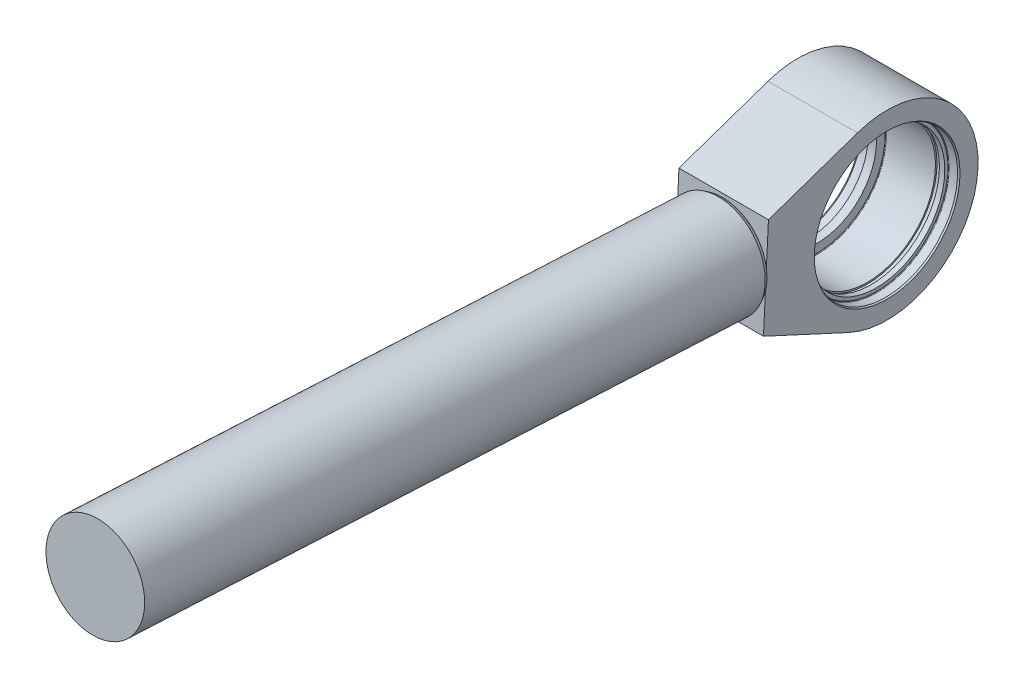
ISO-10303-21;
HEADER;
FILE_DESCRIPTION(('STEP AP214'),'2;1');
FILE_NAME('part.step','',(''),(''),'','','');
FILE_SCHEMA(('AUTOMOTIVE_DESIGN { 1 0 10303 214 1 1 1 1 }'));
ENDSEC;
DATA;
#1=APPLICATION_CONTEXT('core data for automotive mechanical design processes');
#2=APPLICATION_PROTOCOL_DEFINITION('international standard','automotive_design',2000,#1);
#3=PRODUCT_CONTEXT('',#1,'mechanical');
#4=PRODUCT('Part','Part','',(#3));
#5=PRODUCT_RELATED_PRODUCT_CATEGORY('part','',(#4));
#6=PRODUCT_DEFINITION_FORMATION('','',#4);
#7=PRODUCT_DEFINITION_CONTEXT('part definition',#1,'design');
#8=PRODUCT_DEFINITION('design','',#6,#7);
#9=PRODUCT_DEFINITION_SHAPE('','',#8);
#10=(LENGTH_UNIT() NAMED_UNIT(*) SI_UNIT(.MILLI.,.METRE.));
#11=(NAMED_UNIT(*) PLANE_ANGLE_UNIT() SI_UNIT($,.RADIAN.));
#12=(NAMED_UNIT(*) SI_UNIT($,.STERADIAN.) SOLID_ANGLE_UNIT());
#13=UNCERTAINTY_MEASURE_WITH_UNIT(LENGTH_MEASURE(1.E-05),#10,'distance_accuracy_value','');
#14=(GEOMETRIC_REPRESENTATION_CONTEXT(3) GLOBAL_UNCERTAINTY_ASSIGNED_CONTEXT((#13)) GLOBAL_UNIT_ASSIGNED_CONTEXT((#10,
#11,#12)) REPRESENTATION_CONTEXT('',''));
#15=CARTESIAN_POINT('',(0.,0.,0.));
#16=DIRECTION('',(0.,0.,1.));
#17=DIRECTION('',(1.,0.,0.));
#18=AXIS2_PLACEMENT_3D('',#15,#16,#17);
#19=CARTESIAN_POINT('',(16.400000000094,299.27285870863,577.94256465384));
#20=DIRECTION('',(1.,0.,0.));
#21=DIRECTION('',(0.,0.,-1.));
#22=AXIS2_PLACEMENT_3D('',#19,#20,#21);
#23=PLANE('',#22);
#24=CARTESIAN_POINT('',(16.400000000094,297.00000000245,533.00000004854));
#25=DIRECTION('',(1.,0.,0.));
#26=DIRECTION('',(0.,0.,-1.));
#27=AXIS2_PLACEMENT_3D('',#24,#25,#26);
#28=CIRCLE('',#27,45.);
#29=CARTESIAN_POINT('',(16.400000000094,297.00000000245,488.00000004854));
#30=VERTEX_POINT('',#29);
#31=EDGE_CURVE('E20',#30,#30,#28,.F.);
#32=ORIENTED_EDGE('',*,*,#31,.T.);
#33=EDGE_LOOP('',(#32));
#34=FACE_BOUND('',#33,.T.);
#35=CARTESIAN_POINT('',(16.400000000094,297.00000000245,533.00000004854));
#36=DIRECTION('',(1.,0.,0.));
#37=DIRECTION('',(0.,0.,-1.));
#38=AXIS2_PLACEMENT_3D('',#35,#36,#37);
#39=CIRCLE('',#38,46.);
#40=CARTESIAN_POINT('',(16.400000000094,297.00000000245,487.00000004854));
#41=VERTEX_POINT('',#40);
#42=EDGE_CURVE('E250',#41,#41,#39,.T.);
#43=ORIENTED_EDGE('',*,*,#42,.T.);
#44=EDGE_LOOP('',(#43));
#45=FACE_BOUND('',#44,.T.);
#46=ADVANCED_FACE('F17',(#34,#45),#23,.T.);
#47=CARTESIAN_POINT('',(-0.377498252838,297.00000000245,533.00000004854));
#48=DIRECTION('',(1.,0.,0.));
#49=DIRECTION('',(0.,0.,-1.));
#50=AXIS2_PLACEMENT_3D('',#47,#48,#49);
#51=CYLINDRICAL_SURFACE('',#50,45.);
#52=ORIENTED_EDGE('',*,*,#31,.F.);
#53=EDGE_LOOP('',(#52));
#54=FACE_BOUND('',#53,.T.);
#55=CARTESIAN_POINT('',(-16.0999999999,297.00000000245,533.00000004854));
#56=DIRECTION('',(1.,0.,0.));
#57=DIRECTION('',(0.,0.,-1.));
#58=AXIS2_PLACEMENT_3D('',#55,#56,#57);
#59=CIRCLE('',#58,45.);
#60=CARTESIAN_POINT('',(-16.0999999999,297.00000000245,488.00000004854));
#61=VERTEX_POINT('',#60);
#62=EDGE_CURVE('E206',#61,#61,#59,.F.);
#63=ORIENTED_EDGE('',*,*,#62,.T.);
#64=EDGE_LOOP('',(#63));
#65=FACE_BOUND('',#64,.T.);
#66=ADVANCED_FACE('F259',(#54,#65),#51,.F.);
#67=CARTESIAN_POINT('',(-0.377498252838,297.00000000245,533.00000004854));
#68=DIRECTION('',(1.,0.,0.));
#69=DIRECTION('',(0.,0.,-1.));
#70=AXIS2_PLACEMENT_3D('',#67,#68,#69);
#71=CYLINDRICAL_SURFACE('',#70,46.);
#72=CARTESIAN_POINT('',(19.000000000094,297.00000000245,533.00000004854));
#73=DIRECTION('',(1.,0.,0.));
#74=DIRECTION('',(0.,0.,-1.));
#75=AXIS2_PLACEMENT_3D('',#72,#73,#74);
#76=CIRCLE('',#75,46.);
#77=CARTESIAN_POINT('',(19.000000000094,297.00000000245,487.00000004854));
#78=VERTEX_POINT('',#77);
#79=EDGE_CURVE('E248',#78,#78,#76,.T.);
#80=ORIENTED_EDGE('',*,*,#79,.T.);
#81=EDGE_LOOP('',(#80));
#82=FACE_BOUND('',#81,.T.);
#83=ORIENTED_EDGE('',*,*,#42,.F.);
#84=EDGE_LOOP('',(#83));
#85=FACE_BOUND('',#84,.T.);
#86=ADVANCED_FACE('F212',(#82,#85),#71,.F.);
#87=CARTESIAN_POINT('',(-16.0999999999,297.00000000245,533.00000004854));
#88=DIRECTION('',(1.,0.,0.));
#89=DIRECTION('',(0.,0.,-1.));
#90=AXIS2_PLACEMENT_3D('',#87,#88,#89);
#91=TOROIDAL_SURFACE('',#90,44.6,0.4);
#92=ORIENTED_EDGE('',*,*,#62,.F.);
#93=EDGE_LOOP('',(#92));
#94=FACE_BOUND('',#93,.T.);
#95=CARTESIAN_POINT('',(-16.4999999999,297.00000000245,533.00000004854));
#96=DIRECTION('',(-1.,0.,0.));
#97=DIRECTION('',(0.,0.434488716687866,-0.900677275760264));
#98=AXIS2_PLACEMENT_3D('',#95,#96,#97);
#99=CIRCLE('',#98,44.6000000000025);
#100=CARTESIAN_POINT('',(-16.4999999999,316.37819676673,492.82979354963));
#101=VERTEX_POINT('',#100);
#102=EDGE_CURVE('E247',#101,#101,#99,.F.);
#103=ORIENTED_EDGE('',*,*,#102,.F.);
#104=EDGE_LOOP('',(#103));
#105=FACE_BOUND('',#104,.T.);
#106=ADVANCED_FACE('F208',(#94,#105),#91,.F.);
#107=CARTESIAN_POINT('',(19.000000000094,299.32336667988,578.94128831174));
#108=DIRECTION('',(1.,0.,0.));
#109=DIRECTION('',(0.,0.,-1.));
#110=AXIS2_PLACEMENT_3D('',#107,#108,#109);
#111=PLANE('',#110);
#112=CARTESIAN_POINT('',(19.000000000094,297.00000000245,533.00000004854));
#113=DIRECTION('',(1.,0.,0.));
#114=DIRECTION('',(0.,0.,-1.));
#115=AXIS2_PLACEMENT_3D('',#112,#113,#114);
#116=CIRCLE('',#115,45.);
#117=CARTESIAN_POINT('',(19.000000000094,297.00000000245,488.00000004854));
#118=VERTEX_POINT('',#117);
#119=EDGE_CURVE('E244',#118,#118,#116,.T.);
#120=ORIENTED_EDGE('',*,*,#119,.T.);
#121=EDGE_LOOP('',(#120));
#122=FACE_BOUND('',#121,.T.);
#123=ORIENTED_EDGE('',*,*,#79,.F.);
#124=EDGE_LOOP('',(#123));
#125=FACE_BOUND('',#124,.T.);
#126=ADVANCED_FACE('F190',(#122,#125),#111,.F.);
#127=CARTESIAN_POINT('',(-16.4999999999,298.96981088114,571.95022270647));
#128=DIRECTION('',(1.,0.,0.));
#129=DIRECTION('',(0.,0.,-1.));
#130=AXIS2_PLACEMENT_3D('',#127,#128,#129);
#131=PLANE('',#130);
#132=CARTESIAN_POINT('',(-16.4999999999,297.00000000245,533.00000004854));
#133=DIRECTION('',(1.,0.,0.));
#134=DIRECTION('',(0.,0.,-1.));
#135=AXIS2_PLACEMENT_3D('',#132,#133,#134);
#136=CIRCLE('',#135,39.);
#137=CARTESIAN_POINT('',(-16.4999999999,297.00000000245,494.00000004854));
#138=VERTEX_POINT('',#137);
#139=EDGE_CURVE('E241',#138,#138,#136,.F.);
#140=ORIENTED_EDGE('',*,*,#139,.T.);
#141=EDGE_LOOP('',(#140));
#142=FACE_BOUND('',#141,.T.);
#143=ORIENTED_EDGE('',*,*,#102,.T.);
#144=EDGE_LOOP('',(#143));
#145=FACE_BOUND('',#144,.T.);
#146=ADVANCED_FACE('F185',(#142,#145),#131,.T.);
#147=CARTESIAN_POINT('',(-0.377498252838,297.00000000245,533.00000004854));
#148=DIRECTION('',(1.,0.,0.));
#149=DIRECTION('',(0.,0.,-1.));
#150=AXIS2_PLACEMENT_3D('',#147,#148,#149);
#151=CYLINDRICAL_SURFACE('',#150,45.);
#152=CARTESIAN_POINT('',(22.500000000094,297.00000000245,533.00000004854));
#153=DIRECTION('',(1.,0.,0.));
#154=DIRECTION('',(0.,0.,-1.));
#155=AXIS2_PLACEMENT_3D('',#152,#153,#154);
#156=CIRCLE('',#155,45.);
#157=CARTESIAN_POINT('',(22.500000000094,297.00000000245,488.00000004854));
#158=VERTEX_POINT('',#157);
#159=EDGE_CURVE('E238',#158,#158,#156,.F.);
#160=ORIENTED_EDGE('',*,*,#159,.F.);
#161=EDGE_LOOP('',(#160));
#162=FACE_BOUND('',#161,.T.);
#163=ORIENTED_EDGE('',*,*,#119,.F.);
#164=EDGE_LOOP('',(#163));
#165=FACE_BOUND('',#164,.T.);
#166=ADVANCED_FACE('F181',(#162,#165),#151,.F.);
#167=CARTESIAN_POINT('',(-0.377498252838,297.00000000245,533.00000004854));
#168=DIRECTION('',(1.,0.,0.));
#169=DIRECTION('',(0.,0.,-1.));
#170=AXIS2_PLACEMENT_3D('',#167,#168,#169);
#171=CYLINDRICAL_SURFACE('',#170,39.);
#172=ORIENTED_EDGE('',*,*,#139,.F.);
#173=EDGE_LOOP('',(#172));
#174=FACE_BOUND('',#173,.T.);
#175=CARTESIAN_POINT('',(-21.9999999999,297.00000000245,533.00000004854));
#176=DIRECTION('',(1.,0.,0.));
#177=DIRECTION('',(0.,0.,-1.));
#178=AXIS2_PLACEMENT_3D('',#175,#176,#177);
#179=CIRCLE('',#178,39.);
#180=CARTESIAN_POINT('',(-21.9999999999,297.00000000245,494.00000004854));
#181=VERTEX_POINT('',#180);
#182=EDGE_CURVE('E235',#181,#181,#179,.F.);
#183=ORIENTED_EDGE('',*,*,#182,.T.);
#184=EDGE_LOOP('',(#183));
#185=FACE_BOUND('',#184,.T.);
#186=ADVANCED_FACE('F176',(#174,#185),#171,.F.);
#187=CARTESIAN_POINT('',(22.500000000094,299.27285870863,577.94256465384));
#188=DIRECTION('',(1.,0.,0.));
#189=DIRECTION('',(0.,0.,-1.));
#190=AXIS2_PLACEMENT_3D('',#187,#188,#189);
#191=PLANE('',#190);
#192=ORIENTED_EDGE('',*,*,#159,.T.);
#193=EDGE_LOOP('',(#192));
#194=FACE_BOUND('',#193,.T.);
#195=CARTESIAN_POINT('',(22.500000000094,297.00000000245,533.00000004854));
#196=DIRECTION('',(-1.,0.,0.));
#197=DIRECTION('',(0.,0.4344887133316,-0.900677277379335));
#198=AXIS2_PLACEMENT_3D('',#195,#196,#197);
#199=CIRCLE('',#198,47.1000000000036);
#200=CARTESIAN_POINT('',(22.500000000094,317.46441840037,490.57810028397));
#201=VERTEX_POINT('',#200);
#202=EDGE_CURVE('E160',#201,#201,#199,.F.);
#203=ORIENTED_EDGE('',*,*,#202,.T.);
#204=EDGE_LOOP('',(#203));
#205=FACE_BOUND('',#204,.T.);
#206=ADVANCED_FACE('F166',(#194,#205),#191,.T.);
#207=CARTESIAN_POINT('',(-21.9999999999,299.07082682364,573.94767002226));
#208=DIRECTION('',(1.,0.,0.));
#209=DIRECTION('',(0.,0.,-1.));
#210=AXIS2_PLACEMENT_3D('',#207,#208,#209);
#211=PLANE('',#210);
#212=ORIENTED_EDGE('',*,*,#182,.F.);
#213=EDGE_LOOP('',(#212));
#214=FACE_BOUND('',#213,.T.);
#215=CARTESIAN_POINT('',(-21.9999999999,297.00000000245,533.00000004854));
#216=DIRECTION('',(1.,0.,0.));
#217=DIRECTION('',(0.,0.434488700871132,-0.900677283390292));
#218=AXIS2_PLACEMENT_3D('',#215,#216,#217);
#219=CIRCLE('',#218,40.6000000000045);
#220=CARTESIAN_POINT('',(-21.9999999999,314.64024125782,496.43250234289));
#221=VERTEX_POINT('',#220);
#222=EDGE_CURVE('E125',#221,#221,#219,.F.);
#223=ORIENTED_EDGE('',*,*,#222,.T.);
#224=EDGE_LOOP('',(#223));
#225=FACE_BOUND('',#224,.T.);
#226=ADVANCED_FACE('F175',(#214,#225),#211,.F.);
#227=CARTESIAN_POINT('',(22.900000000094,297.00000000245,533.00000004854));
#228=DIRECTION('',(1.,0.,0.));
#229=DIRECTION('',(0.,0.,-1.));
#230=AXIS2_PLACEMENT_3D('',#227,#228,#229);
#231=TOROIDAL_SURFACE('',#230,47.1,0.4);
#232=CARTESIAN_POINT('',(22.900000000094,297.00000000245,533.00000004854));
#233=DIRECTION('',(1.,0.,0.));
#234=DIRECTION('',(0.,0.,-1.));
#235=AXIS2_PLACEMENT_3D('',#232,#233,#234);
#236=CIRCLE('',#235,47.5);
#237=CARTESIAN_POINT('',(22.900000000094,297.00000000245,485.50000004854));
#238=VERTEX_POINT('',#237);
#239=EDGE_CURVE('E120',#238,#238,#236,.T.);
#240=ORIENTED_EDGE('',*,*,#239,.T.);
#241=EDGE_LOOP('',(#240));
#242=FACE_BOUND('',#241,.T.);
#243=ORIENTED_EDGE('',*,*,#202,.F.);
#244=EDGE_LOOP('',(#243));
#245=FACE_BOUND('',#244,.T.);
#246=ADVANCED_FACE('F139',(#242,#245),#231,.F.);
#247=CARTESIAN_POINT('',(-22.3999999999,297.00000000245,533.00000004854));
#248=DIRECTION('',(1.,0.,0.));
#249=DIRECTION('',(0.,0.,-1.));
#250=AXIS2_PLACEMENT_3D('',#247,#248,#249);
#251=TOROIDAL_SURFACE('',#250,40.6,0.4);
#252=ORIENTED_EDGE('',*,*,#222,.F.);
#253=EDGE_LOOP('',(#252));
#254=FACE_BOUND('',#253,.T.);
#255=CARTESIAN_POINT('',(-22.3999999999,297.00000000245,533.00000004854));
#256=DIRECTION('',(1.,0.,0.));
#257=DIRECTION('',(0.,0.,-1.));
#258=AXIS2_PLACEMENT_3D('',#255,#256,#257);
#259=CIRCLE('',#258,41.);
#260=CARTESIAN_POINT('',(-22.3999999999,297.00000000245,492.00000004854));
#261=VERTEX_POINT('',#260);
#262=EDGE_CURVE('E115',#261,#261,#259,.F.);
#263=ORIENTED_EDGE('',*,*,#262,.T.);
#264=EDGE_LOOP('',(#263));
#265=FACE_BOUND('',#264,.T.);
#266=ADVANCED_FACE('F133',(#254,#265),#251,.F.);
#267=CARTESIAN_POINT('',(-0.377498252838,297.00000000245,533.00000004854));
#268=DIRECTION('',(1.,0.,0.));
#269=DIRECTION('',(0.,0.,-1.));
#270=AXIS2_PLACEMENT_3D('',#267,#268,#269);
#271=CYLINDRICAL_SURFACE('',#270,47.5);
#272=CARTESIAN_POINT('',(28.5000000032234,297.00000000245,533.00000004854));
#273=DIRECTION('',(1.,0.,0.));
#274=DIRECTION('',(0.,-0.998723657895598,0.0505079712484599));
#275=AXIS2_PLACEMENT_3D('',#272,#273,#274);
#276=CIRCLE('',#275,47.4999999945809);
#277=CARTESIAN_POINT('',(28.5000000032234,249.560626257821,535.399128682568));
#278=VERTEX_POINT('',#277);
#279=EDGE_CURVE('E100',#278,#278,#276,.T.);
#280=ORIENTED_EDGE('',*,*,#279,.T.);
#281=EDGE_LOOP('',(#280));
#282=FACE_BOUND('',#281,.T.);
#283=ORIENTED_EDGE('',*,*,#239,.F.);
#284=EDGE_LOOP('',(#283));
#285=FACE_BOUND('',#284,.T.);
#286=ADVANCED_FACE('F138',(#282,#285),#271,.F.);
#287=CARTESIAN_POINT('',(-0.377498252838,297.00000000245,533.00000004854));
#288=DIRECTION('',(1.,0.,0.));
#289=DIRECTION('',(0.,0.,-1.));
#290=AXIS2_PLACEMENT_3D('',#287,#288,#289);
#291=CYLINDRICAL_SURFACE('',#290,41.);
#292=CARTESIAN_POINT('',(-28.5000000030495,297.00000000245,533.00000004854));
#293=DIRECTION('',(-1.,0.,0.));
#294=DIRECTION('',(0.,-0.998723657895599,0.0505079712484609));
#295=AXIS2_PLACEMENT_3D('',#292,#293,#294);
#296=CIRCLE('',#295,40.9999999945437);
#297=CARTESIAN_POINT('',(-28.5000000030495,256.05233003418,535.070826869451));
#298=VERTEX_POINT('',#297);
#299=EDGE_CURVE('E97',#298,#298,#296,.T.);
#300=ORIENTED_EDGE('',*,*,#299,.T.);
#301=EDGE_LOOP('',(#300));
#302=FACE_BOUND('',#301,.T.);
#303=ORIENTED_EDGE('',*,*,#262,.F.);
#304=EDGE_LOOP('',(#303));
#305=FACE_BOUND('',#304,.T.);
#306=ADVANCED_FACE('F355',(#302,#305),#291,.F.);
#307=CARTESIAN_POINT('',(29.5000000032197,297.00000000245,533.00000004854));
#308=DIRECTION('',(1.,0.,0.));
#309=DIRECTION('',(0.,0.,-1.));
#310=AXIS2_PLACEMENT_3D('',#307,#308,#309);
#311=CONICAL_SURFACE('',#310,48.0773502637731,0.523598775601787);
#312=ORIENTED_EDGE('',*,*,#279,.F.);
#313=EDGE_LOOP('',(#312));
#314=FACE_BOUND('',#313,.T.);
#315=CARTESIAN_POINT('',(29.5000000032199,297.00000000245,533.00000004854));
#316=DIRECTION('',(1.,0.,0.));
#317=DIRECTION('',(0.,0.,-1.));
#318=AXIS2_PLACEMENT_3D('',#315,#316,#317);
#319=CIRCLE('',#318,48.0773502637732);
#320=CARTESIAN_POINT('',(29.5000000032199,297.00000000245,484.922649784767));
#321=VERTEX_POINT('',#320);
#322=EDGE_CURVE('E105',#321,#321,#319,.F.);
#323=ORIENTED_EDGE('',*,*,#322,.F.);
#324=EDGE_LOOP('',(#323));
#325=FACE_BOUND('',#324,.T.);
#326=ADVANCED_FACE('F352',(#314,#325),#311,.F.);
#327=CARTESIAN_POINT('',(-29.5000000030501,297.00000000245,533.00000004854));
#328=DIRECTION('',(-1.,0.,0.));
#329=DIRECTION('',(0.,0.,1.));
#330=AXIS2_PLACEMENT_3D('',#327,#328,#329);
#331=CONICAL_SURFACE('',#330,41.5773502637381,0.523598775601639);
#332=ORIENTED_EDGE('',*,*,#299,.F.);
#333=EDGE_LOOP('',(#332));
#334=FACE_BOUND('',#333,.T.);
#335=CARTESIAN_POINT('',(-29.5000000030501,297.00000000245,533.00000004854));
#336=DIRECTION('',(-1.,0.,0.));
#337=DIRECTION('',(0.,0.,1.));
#338=AXIS2_PLACEMENT_3D('',#335,#336,#337);
#339=CIRCLE('',#338,41.5773502637381);
#340=CARTESIAN_POINT('',(-29.5000000030501,297.00000000245,574.577350312278));
#341=VERTEX_POINT('',#340);
#342=EDGE_CURVE('E92',#341,#341,#339,.T.);
#343=ORIENTED_EDGE('',*,*,#342,.T.);
#344=EDGE_LOOP('',(#343));
#345=FACE_BOUND('',#344,.T.);
#346=ADVANCED_FACE('F349',(#334,#345),#331,.F.);
#347=CARTESIAN_POINT('',(9.399776588053E-11,297.00000000245,533.00000004854));
#348=DIRECTION('',(1.,0.,0.));
#349=DIRECTION('',(0.,0.,-1.));
#350=AXIS2_PLACEMENT_3D('',#347,#348,#349);
#351=CYLINDRICAL_SURFACE('',#350,60.);
#352=DIRECTION('',(1.,0.,0.));
#353=VECTOR('',#352,1.);
#354=CARTESIAN_POINT('',(9.393061639508E-11,353.727470244884,552.544669907428));
#355=LINE('',#354,#353);
#356=CARTESIAN_POINT('',(-29.4999999999,353.727470244888,552.544669907427));
#357=VERTEX_POINT('',#356);
#358=CARTESIAN_POINT('',(29.500000000094,353.727470244885,552.544669907424));
#359=VERTEX_POINT('',#358);
#360=EDGE_CURVE('E103',#357,#359,#355,.T.);
#361=ORIENTED_EDGE('',*,*,#360,.T.);
#362=CARTESIAN_POINT('',(29.500000000094,297.00000000245,533.00000004854));
#363=DIRECTION('',(1.,0.,0.));
#364=DIRECTION('',(0.,0.,-1.));
#365=AXIS2_PLACEMENT_3D('',#362,#363,#364);
#366=CIRCLE('',#365,60.);
#367=CARTESIAN_POINT('',(29.500000000094,242.533762906036,558.168015793821));
#368=VERTEX_POINT('',#367);
#369=EDGE_CURVE('E55',#368,#359,#366,.T.);
#370=ORIENTED_EDGE('',*,*,#369,.F.);
#371=DIRECTION('',(1.,0.,0.));
#372=VECTOR('',#371,1.);
#373=CARTESIAN_POINT('',(9.390824892847E-11,242.53376290604,558.168015793831));
#374=LINE('',#373,#372);
#375=CARTESIAN_POINT('',(-29.4999999999,242.533762906036,558.168015793821));
#376=VERTEX_POINT('',#375);
#377=EDGE_CURVE('E77',#376,#368,#374,.T.);
#378=ORIENTED_EDGE('',*,*,#377,.F.);
#379=CARTESIAN_POINT('',(-29.4999999999,297.00000000245,533.00000004854));
#380=DIRECTION('',(1.,0.,0.));
#381=DIRECTION('',(0.,0.,-1.));
#382=AXIS2_PLACEMENT_3D('',#379,#380,#381);
#383=CIRCLE('',#382,60.);
#384=EDGE_CURVE('E229',#376,#357,#383,.T.);
#385=ORIENTED_EDGE('',*,*,#384,.T.);
#386=EDGE_LOOP('',(#361,#370,#378,#385));
#387=FACE_BOUND('',#386,.T.);
#388=ADVANCED_FACE('F345',(#387),#351,.T.);
#389=CARTESIAN_POINT('',(29.500000000094,297.00000000245,533.00000004854));
#390=DIRECTION('',(1.,0.,0.));
#391=DIRECTION('',(0.,0.,-1.));
#392=AXIS2_PLACEMENT_3D('',#389,#390,#391);
#393=PLANE('',#392);
#394=ORIENTED_EDGE('',*,*,#322,.T.);
#395=EDGE_LOOP('',(#394));
#396=FACE_BOUND('',#395,.T.);
#397=DIRECTION('',(0.,-0.998723657895599,0.0505079712484597));
#398=VECTOR('',#397,1.);
#399=CARTESIAN_POINT('',(29.500000000094,301.04063770233,612.89789268019));
#400=LINE('',#399,#398);
#401=CARTESIAN_POINT('',(29.500000000094,268.58211882072,614.539401745761));
#402=VERTEX_POINT('',#401);
#403=CARTESIAN_POINT('',(29.500000000094,333.49915658394,611.256383614614));
#404=VERTEX_POINT('',#403);
#405=EDGE_CURVE('E60',#402,#404,#400,.F.);
#406=ORIENTED_EDGE('',*,*,#405,.F.);
#407=DIRECTION('',(0.,-0.419466929087984,-0.907770618273965));
#408=VECTOR('',#407,1.);
#409=CARTESIAN_POINT('',(29.500000000094,268.58211882072,614.53940174576));
#410=LINE('',#409,#408);
#411=EDGE_CURVE('E63',#368,#402,#410,.F.);
#412=ORIENTED_EDGE('',*,*,#411,.F.);
#413=ORIENTED_EDGE('',*,*,#369,.T.);
#414=DIRECTION('',(0.,0.325744497648021,-0.945457837374062));
#415=VECTOR('',#414,1.);
#416=CARTESIAN_POINT('',(29.500000000094,333.49915658394,611.25638361461));
#417=LINE('',#416,#415);
#418=EDGE_CURVE('E66',#359,#404,#417,.F.);
#419=ORIENTED_EDGE('',*,*,#418,.T.);
#420=EDGE_LOOP('',(#406,#412,#413,#419));
#421=FACE_BOUND('',#420,.T.);
#422=ADVANCED_FACE('F62',(#396,#421),#393,.T.);
#423=CARTESIAN_POINT('',(9.393061639508E-11,333.49915658394,611.25638361461));
#424=DIRECTION('',(0.,-0.945457837374062,-0.325744497648021));
#425=DIRECTION('',(0.,0.325744497648021,-0.945457837374062));
#426=AXIS2_PLACEMENT_3D('',#423,#424,#425);
#427=PLANE('',#426);
#428=ORIENTED_EDGE('',*,*,#360,.F.);
#429=DIRECTION('',(0.,-0.325744497648116,0.945457837374029));
#430=VECTOR('',#429,1.);
#431=CARTESIAN_POINT('',(-29.4999999999,353.72747024489,552.54466990743));
#432=LINE('',#431,#430);
#433=CARTESIAN_POINT('',(-29.4999999999,333.49915658394,611.256383614612));
#434=VERTEX_POINT('',#433);
#435=EDGE_CURVE('E110',#357,#434,#432,.T.);
#436=ORIENTED_EDGE('',*,*,#435,.T.);
#437=DIRECTION('',(1.,0.,0.));
#438=VECTOR('',#437,1.);
#439=CARTESIAN_POINT('',(9.391943266178E-11,333.499156583941,611.256383614615));
#440=LINE('',#439,#438);
#441=EDGE_CURVE('E71',#404,#434,#440,.F.);
#442=ORIENTED_EDGE('',*,*,#441,.F.);
#443=ORIENTED_EDGE('',*,*,#418,.F.);
#444=EDGE_LOOP('',(#428,#436,#442,#443));
#445=FACE_BOUND('',#444,.T.);
#446=ADVANCED_FACE('F330',(#445),#427,.F.);
#447=CARTESIAN_POINT('',(-29.4999999999,297.00000000245,533.00000004854));
#448=DIRECTION('',(1.,0.,0.));
#449=DIRECTION('',(0.,0.,-1.));
#450=AXIS2_PLACEMENT_3D('',#447,#448,#449);
#451=PLANE('',#450);
#452=ORIENTED_EDGE('',*,*,#342,.F.);
#453=EDGE_LOOP('',(#452));
#454=FACE_BOUND('',#453,.T.);
#455=DIRECTION('',(0.,-0.419466929087984,-0.907770618273965));
#456=VECTOR('',#455,1.);
#457=CARTESIAN_POINT('',(-29.4999999999,268.58211882072,614.53940174576));
#458=LINE('',#457,#456);
#459=CARTESIAN_POINT('',(-29.4999999999,268.58211882072,614.539401745763));
#460=VERTEX_POINT('',#459);
#461=EDGE_CURVE('E35',#460,#376,#458,.T.);
#462=ORIENTED_EDGE('',*,*,#461,.F.);
#463=DIRECTION('',(0.,-0.998723657895599,0.0505079712484597));
#464=VECTOR('',#463,1.);
#465=CARTESIAN_POINT('',(-29.4999999999,301.04063770233,612.89789268019));
#466=LINE('',#465,#464);
#467=EDGE_CURVE('E80',#434,#460,#466,.T.);
#468=ORIENTED_EDGE('',*,*,#467,.F.);
#469=ORIENTED_EDGE('',*,*,#435,.F.);
#470=ORIENTED_EDGE('',*,*,#384,.F.);
#471=EDGE_LOOP('',(#462,#468,#469,#470));
#472=FACE_BOUND('',#471,.T.);
#473=ADVANCED_FACE('F331',(#454,#472),#451,.F.);
#474=CARTESIAN_POINT('',(9.390824892847E-11,268.58211882072,614.53940174576));
#475=DIRECTION('',(0.,-0.907770618273965,0.419466929087984));
#476=DIRECTION('',(0.,-0.419466929087984,-0.907770618273965));
#477=AXIS2_PLACEMENT_3D('',#474,#475,#476);
#478=PLANE('',#477);
#479=ORIENTED_EDGE('',*,*,#377,.T.);
#480=ORIENTED_EDGE('',*,*,#411,.T.);
#481=DIRECTION('',(1.,0.,0.));
#482=VECTOR('',#481,1.);
#483=CARTESIAN_POINT('',(9.391943266178E-11,268.58211882072,614.539401745765));
#484=LINE('',#483,#482);
#485=EDGE_CURVE('E75',#460,#402,#484,.T.);
#486=ORIENTED_EDGE('',*,*,#485,.F.);
#487=ORIENTED_EDGE('',*,*,#461,.T.);
#488=EDGE_LOOP('',(#479,#480,#486,#487));
#489=FACE_BOUND('',#488,.T.);
#490=ADVANCED_FACE('F74',(#489),#478,.T.);
#491=CARTESIAN_POINT('',(9.391943266178E-11,301.04063770233,612.89789268019));
#492=DIRECTION('',(0.,0.0505079712484597,0.998723657895599));
#493=DIRECTION('',(0.,-0.998723657895599,0.0505079712484597));
#494=AXIS2_PLACEMENT_3D('',#491,#492,#493);
#495=PLANE('',#494);
#496=CARTESIAN_POINT('',(9.39123272344187E-11,301.040637702333,612.897892680189));
#497=DIRECTION('',(0.,0.0505079712484597,0.998723657895599));
#498=DIRECTION('',(3.22696541549426E-07,0.998723657895547,-0.0505079712484564));
#499=AXIS2_PLACEMENT_3D('',#496,#497,#498);
#500=CIRCLE('',#499,29.3245735194551);
#501=CARTESIAN_POINT('',(9.46303236946726E-06,330.32778303391,611.416767963995));
#502=VERTEX_POINT('',#501);
#503=EDGE_CURVE('E81',#502,#502,#500,.T.);
#504=ORIENTED_EDGE('',*,*,#503,.F.);
#505=EDGE_LOOP('',(#504));
#506=FACE_BOUND('',#505,.T.);
#507=ORIENTED_EDGE('',*,*,#467,.T.);
#508=ORIENTED_EDGE('',*,*,#485,.T.);
#509=ORIENTED_EDGE('',*,*,#405,.T.);
#510=ORIENTED_EDGE('',*,*,#441,.T.);
#511=EDGE_LOOP('',(#507,#508,#509,#510));
#512=FACE_BOUND('',#511,.T.);
#513=ADVANCED_FACE('F79',(#506,#512),#495,.T.);
#514=CARTESIAN_POINT('',(9.391036890395E-11,301.14165364483,614.89533999598));
#515=DIRECTION('',(0.,0.0505079712484597,0.998723657895599));
#516=DIRECTION('',(1.,0.,0.));
#517=AXIS2_PLACEMENT_3D('',#514,#515,#516);
#518=TOROIDAL_SURFACE('',#517,29.324573519457,2.);
#519=CARTESIAN_POINT('',(9.39138857218052E-11,301.091145673773,613.896616341474));
#520=DIRECTION('',(0.,0.0505079712484597,0.998723657895599));
#521=DIRECTION('',(0.,-0.998723657895599,0.0505079712484592));
#522=AXIS2_PLACEMENT_3D('',#519,#520,#521);
#523=CIRCLE('',#522,31.0566243211748);
#524=CARTESIAN_POINT('',(9.3911890146756E-11,270.07416022984,615.465223429762));
#525=VERTEX_POINT('',#524);
#526=EDGE_CURVE('E84',#525,#525,#523,.T.);
#527=ORIENTED_EDGE('',*,*,#526,.F.);
#528=EDGE_LOOP('',(#527));
#529=FACE_BOUND('',#528,.T.);
#530=ORIENTED_EDGE('',*,*,#503,.T.);
#531=EDGE_LOOP('',(#530));
#532=FACE_BOUND('',#531,.T.);
#533=ADVANCED_FACE('F288',(#529,#532),#518,.T.);
#534=CARTESIAN_POINT('',(9.351479262868E-11,321.91305682077,1025.620444306));
#535=DIRECTION('',(0.,0.0505079712484597,0.998723657895599));
#536=DIRECTION('',(0.,-0.998723657895599,0.0505079712484597));
#537=AXIS2_PLACEMENT_3D('',#534,#535,#536);
#538=PLANE('',#537);
#539=CARTESIAN_POINT('',(9.35147926286839E-11,321.913056820758,1025.62044430543));
#540=DIRECTION('',(0.,0.0505079712484597,0.998723657895599));
#541=DIRECTION('',(0.,-0.998723657895599,0.0505079712484597));
#542=AXIS2_PLACEMENT_3D('',#539,#540,#541);
#543=CIRCLE('',#542,32.5);
#544=CARTESIAN_POINT('',(9.35147926286839E-11,289.454537939151,1027.261953371));
#545=VERTEX_POINT('',#544);
#546=EDGE_CURVE('E26',#545,#545,#543,.F.);
#547=ORIENTED_EDGE('',*,*,#546,.F.);
#548=EDGE_LOOP('',(#547));
#549=FACE_BOUND('',#548,.T.);
#550=ADVANCED_FACE('F281',(#549),#538,.T.);
#551=CARTESIAN_POINT('',(9.39089001560917E-11,301.217415601894,616.393425486208));
#552=DIRECTION('',(0.,0.0505079712484608,0.998723657895599));
#553=DIRECTION('',(0.,-0.998723657895599,0.0505079712484608));
#554=AXIS2_PLACEMENT_3D('',#551,#552,#553);
#555=CONICAL_SURFACE('',#554,32.4999999941575,0.52359877560174);
#556=ORIENTED_EDGE('',*,*,#526,.T.);
#557=EDGE_LOOP('',(#556));
#558=FACE_BOUND('',#557,.T.);
#559=CARTESIAN_POINT('',(9.3916005583456E-11,301.217415601707,616.393425482824));
#560=DIRECTION('',(0.,0.0505079712484597,0.998723657895599));
#561=DIRECTION('',(0.,-0.998723657895599,0.0505079712484597));
#562=AXIS2_PLACEMENT_3D('',#559,#560,#561);
#563=CIRCLE('',#562,32.5);
#564=CARTESIAN_POINT('',(9.3916005583456E-11,268.7588967201,618.034934548399));
#565=VERTEX_POINT('',#564);
#566=EDGE_CURVE('E11',#565,#565,#563,.T.);
#567=ORIENTED_EDGE('',*,*,#566,.F.);
#568=EDGE_LOOP('',(#567));
#569=FACE_BOUND('',#568,.T.);
#570=ADVANCED_FACE('F274',(#558,#569),#555,.T.);
#571=CARTESIAN_POINT('',(9.371711264523E-11,311.47684726155,819.25916849286));
#572=DIRECTION('',(0.,0.0505079712484597,0.998723657895599));
#573=DIRECTION('',(0.,-0.998723657895599,0.0505079712484597));
#574=AXIS2_PLACEMENT_3D('',#571,#572,#573);
#575=CYLINDRICAL_SURFACE('',#574,32.5);
#576=ORIENTED_EDGE('',*,*,#566,.T.);
#577=EDGE_LOOP('',(#576));
#578=FACE_BOUND('',#577,.T.);
#579=ORIENTED_EDGE('',*,*,#546,.T.);
#580=EDGE_LOOP('',(#579));
#581=FACE_BOUND('',#580,.T.);
#582=ADVANCED_FACE('F272',(#578,#581),#575,.T.);
#583=CLOSED_SHELL('',(#46,#66,#86,#106,#126,#146,#166,#186,#206,#226,#246,#266,#286,#306,#326,
#346,#388,#422,#446,#473,#490,#513,#533,#550,#570,#582));
#584=MANIFOLD_SOLID_BREP('B1',#583);
#585=ADVANCED_BREP_SHAPE_REPRESENTATION('',(#18,#584),#14);
#586=SHAPE_DEFINITION_REPRESENTATION(#9,#585);
ENDSEC;
END-ISO-10303-21;
